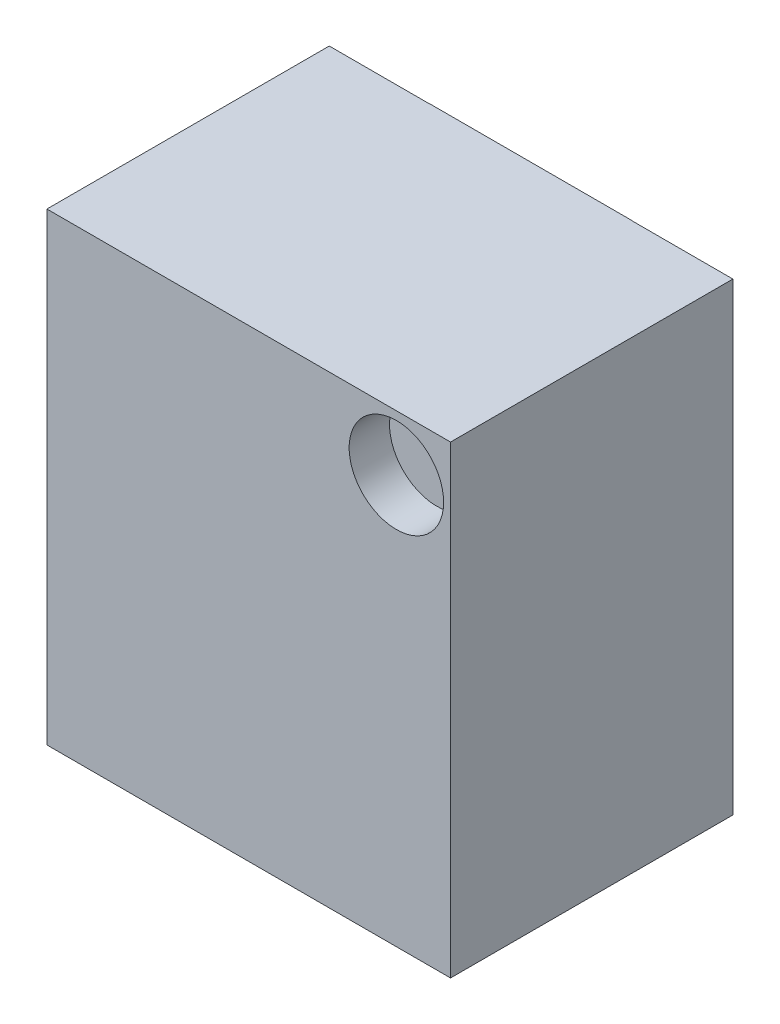
ISO-10303-21;
HEADER;
FILE_DESCRIPTION(('STEP AP214'),'2;1');
FILE_NAME('part.step','',(''),(''),'','','');
FILE_SCHEMA(('AUTOMOTIVE_DESIGN { 1 0 10303 214 1 1 1 1 }'));
ENDSEC;
DATA;
#1=APPLICATION_CONTEXT('core data for automotive mechanical design processes');
#2=APPLICATION_PROTOCOL_DEFINITION('international standard','automotive_design',2000,#1);
#3=PRODUCT_CONTEXT('',#1,'mechanical');
#4=PRODUCT('Part','Part','',(#3));
#5=PRODUCT_RELATED_PRODUCT_CATEGORY('part','',(#4));
#6=PRODUCT_DEFINITION_FORMATION('','',#4);
#7=PRODUCT_DEFINITION_CONTEXT('part definition',#1,'design');
#8=PRODUCT_DEFINITION('design','',#6,#7);
#9=PRODUCT_DEFINITION_SHAPE('','',#8);
#10=(LENGTH_UNIT() NAMED_UNIT(*) SI_UNIT(.MILLI.,.METRE.));
#11=(NAMED_UNIT(*) PLANE_ANGLE_UNIT() SI_UNIT($,.RADIAN.));
#12=(NAMED_UNIT(*) SI_UNIT($,.STERADIAN.) SOLID_ANGLE_UNIT());
#13=UNCERTAINTY_MEASURE_WITH_UNIT(LENGTH_MEASURE(1.E-05),#10,'distance_accuracy_value','');
#14=(GEOMETRIC_REPRESENTATION_CONTEXT(3) GLOBAL_UNCERTAINTY_ASSIGNED_CONTEXT((#13)) GLOBAL_UNIT_ASSIGNED_CONTEXT((#10,
#11,#12)) REPRESENTATION_CONTEXT('',''));
#15=CARTESIAN_POINT('',(0.,0.,0.));
#16=DIRECTION('',(0.,0.,1.));
#17=DIRECTION('',(1.,0.,0.));
#18=AXIS2_PLACEMENT_3D('',#15,#16,#17);
#19=CARTESIAN_POINT('',(1.,-1.15,1.4));
#20=DIRECTION('',(-1.,0.,0.));
#21=DIRECTION('',(0.,0.,1.));
#22=AXIS2_PLACEMENT_3D('',#19,#20,#21);
#23=PLANE('',#22);
#24=DIRECTION('',(0.,-1.,0.));
#25=VECTOR('',#24,1.);
#26=CARTESIAN_POINT('',(1.,-1.15,0.001));
#27=LINE('',#26,#25);
#28=CARTESIAN_POINT('',(1.,-0.65,0.001));
#29=VERTEX_POINT('',#28);
#30=CARTESIAN_POINT('',(1.,-1.15,0.001));
#31=VERTEX_POINT('',#30);
#32=EDGE_CURVE('E279',#29,#31,#27,.T.);
#33=ORIENTED_EDGE('',*,*,#32,.F.);
#34=DIRECTION('',(0.,0.,-1.));
#35=VECTOR('',#34,1.);
#36=CARTESIAN_POINT('',(1.,-0.65,0.001));
#37=LINE('',#36,#35);
#38=CARTESIAN_POINT('',(1.,-0.65,0.));
#39=VERTEX_POINT('',#38);
#40=EDGE_CURVE('E273',#29,#39,#37,.T.);
#41=ORIENTED_EDGE('',*,*,#40,.T.);
#42=DIRECTION('',(0.,1.,0.));
#43=VECTOR('',#42,1.);
#44=CARTESIAN_POINT('',(1.,-1.15,0.));
#45=LINE('',#44,#43);
#46=CARTESIAN_POINT('',(1.,0.65,0.));
#47=VERTEX_POINT('',#46);
#48=EDGE_CURVE('E201',#39,#47,#45,.T.);
#49=ORIENTED_EDGE('',*,*,#48,.T.);
#50=DIRECTION('',(0.,0.,-1.));
#51=VECTOR('',#50,1.);
#52=CARTESIAN_POINT('',(1.,0.65,0.001));
#53=LINE('',#52,#51);
#54=CARTESIAN_POINT('',(1.,0.65,0.001));
#55=VERTEX_POINT('',#54);
#56=EDGE_CURVE('E222',#55,#47,#53,.T.);
#57=ORIENTED_EDGE('',*,*,#56,.F.);
#58=DIRECTION('',(0.,-1.,0.));
#59=VECTOR('',#58,1.);
#60=CARTESIAN_POINT('',(1.,1.15,0.001));
#61=LINE('',#60,#59);
#62=CARTESIAN_POINT('',(1.,1.15,0.001));
#63=VERTEX_POINT('',#62);
#64=EDGE_CURVE('E232',#63,#55,#61,.T.);
#65=ORIENTED_EDGE('',*,*,#64,.F.);
#66=DIRECTION('',(0.,0.,-1.));
#67=VECTOR('',#66,1.);
#68=CARTESIAN_POINT('',(1.,1.15,1.4));
#69=LINE('',#68,#67);
#70=CARTESIAN_POINT('',(1.,1.15,1.4));
#71=VERTEX_POINT('',#70);
#72=EDGE_CURVE('E11',#71,#63,#69,.T.);
#73=ORIENTED_EDGE('',*,*,#72,.F.);
#74=DIRECTION('',(0.,1.,0.));
#75=VECTOR('',#74,1.);
#76=CARTESIAN_POINT('',(1.,-1.15,1.4));
#77=LINE('',#76,#75);
#78=CARTESIAN_POINT('',(1.,-1.15,1.4));
#79=VERTEX_POINT('',#78);
#80=EDGE_CURVE('E193',#79,#71,#77,.T.);
#81=ORIENTED_EDGE('',*,*,#80,.F.);
#82=DIRECTION('',(0.,0.,-1.));
#83=VECTOR('',#82,1.);
#84=CARTESIAN_POINT('',(1.,-1.15,1.4));
#85=LINE('',#84,#83);
#86=EDGE_CURVE('E183',#79,#31,#85,.T.);
#87=ORIENTED_EDGE('',*,*,#86,.T.);
#88=EDGE_LOOP('',(#33,#41,#49,#57,#65,#73,#81,#87));
#89=FACE_BOUND('',#88,.T.);
#90=ADVANCED_FACE('F39',(#89),#23,.F.);
#91=CARTESIAN_POINT('',(-1.,1.15,1.4));
#92=DIRECTION('',(0.,-1.,0.));
#93=DIRECTION('',(0.,0.,-1.));
#94=AXIS2_PLACEMENT_3D('',#91,#92,#93);
#95=PLANE('',#94);
#96=DIRECTION('',(-1.,0.,0.));
#97=VECTOR('',#96,1.);
#98=CARTESIAN_POINT('',(-1.,1.15,0.));
#99=LINE('',#98,#97);
#100=CARTESIAN_POINT('',(0.5,1.15,0.));
#101=VERTEX_POINT('',#100);
#102=CARTESIAN_POINT('',(-0.5,1.15,0.));
#103=VERTEX_POINT('',#102);
#104=EDGE_CURVE('E198',#101,#103,#99,.T.);
#105=ORIENTED_EDGE('',*,*,#104,.T.);
#106=DIRECTION('',(0.,0.,-1.));
#107=VECTOR('',#106,1.);
#108=CARTESIAN_POINT('',(-0.5,1.15,0.001));
#109=LINE('',#108,#107);
#110=CARTESIAN_POINT('',(-0.5,1.15,0.001));
#111=VERTEX_POINT('',#110);
#112=EDGE_CURVE('E54',#111,#103,#109,.T.);
#113=ORIENTED_EDGE('',*,*,#112,.F.);
#114=DIRECTION('',(1.,0.,0.));
#115=VECTOR('',#114,1.);
#116=CARTESIAN_POINT('',(-1.,1.15,0.001));
#117=LINE('',#116,#115);
#118=CARTESIAN_POINT('',(-1.,1.15,0.001));
#119=VERTEX_POINT('',#118);
#120=EDGE_CURVE('E159',#119,#111,#117,.T.);
#121=ORIENTED_EDGE('',*,*,#120,.F.);
#122=DIRECTION('',(0.,0.,-1.));
#123=VECTOR('',#122,1.);
#124=CARTESIAN_POINT('',(-1.,1.15,1.4));
#125=LINE('',#124,#123);
#126=CARTESIAN_POINT('',(-1.,1.15,1.4));
#127=VERTEX_POINT('',#126);
#128=EDGE_CURVE('E47',#127,#119,#125,.T.);
#129=ORIENTED_EDGE('',*,*,#128,.F.);
#130=DIRECTION('',(-1.,0.,0.));
#131=VECTOR('',#130,1.);
#132=CARTESIAN_POINT('',(-1.,1.15,1.4));
#133=LINE('',#132,#131);
#134=EDGE_CURVE('E209',#71,#127,#133,.T.);
#135=ORIENTED_EDGE('',*,*,#134,.F.);
#136=ORIENTED_EDGE('',*,*,#72,.T.);
#137=DIRECTION('',(1.,0.,0.));
#138=VECTOR('',#137,1.);
#139=CARTESIAN_POINT('',(1.,1.15,0.001));
#140=LINE('',#139,#138);
#141=CARTESIAN_POINT('',(0.5,1.15,0.001));
#142=VERTEX_POINT('',#141);
#143=EDGE_CURVE('E226',#142,#63,#140,.T.);
#144=ORIENTED_EDGE('',*,*,#143,.F.);
#145=DIRECTION('',(0.,0.,-1.));
#146=VECTOR('',#145,1.);
#147=CARTESIAN_POINT('',(0.5,1.15,0.001));
#148=LINE('',#147,#146);
#149=EDGE_CURVE('E218',#142,#101,#148,.T.);
#150=ORIENTED_EDGE('',*,*,#149,.T.);
#151=EDGE_LOOP('',(#105,#113,#121,#129,#135,#136,#144,#150));
#152=FACE_BOUND('',#151,.T.);
#153=ADVANCED_FACE('F170',(#152),#95,.F.);
#154=CARTESIAN_POINT('',(-1.,-1.15,1.4));
#155=DIRECTION('',(1.,0.,0.));
#156=DIRECTION('',(0.,0.,-1.));
#157=AXIS2_PLACEMENT_3D('',#154,#155,#156);
#158=PLANE('',#157);
#159=DIRECTION('',(0.,1.,0.));
#160=VECTOR('',#159,1.);
#161=CARTESIAN_POINT('',(-1.,1.15,0.001));
#162=LINE('',#161,#160);
#163=CARTESIAN_POINT('',(-1.,0.65,0.001));
#164=VERTEX_POINT('',#163);
#165=EDGE_CURVE('E155',#164,#119,#162,.T.);
#166=ORIENTED_EDGE('',*,*,#165,.F.);
#167=DIRECTION('',(0.,0.,-1.));
#168=VECTOR('',#167,1.);
#169=CARTESIAN_POINT('',(-1.,0.65,0.001));
#170=LINE('',#169,#168);
#171=CARTESIAN_POINT('',(-1.,0.65,0.));
#172=VERTEX_POINT('',#171);
#173=EDGE_CURVE('E236',#164,#172,#170,.T.);
#174=ORIENTED_EDGE('',*,*,#173,.T.);
#175=DIRECTION('',(0.,-1.,0.));
#176=VECTOR('',#175,1.);
#177=CARTESIAN_POINT('',(-1.,-1.15,0.));
#178=LINE('',#177,#176);
#179=CARTESIAN_POINT('',(-1.,-0.65,0.));
#180=VERTEX_POINT('',#179);
#181=EDGE_CURVE('E194',#172,#180,#178,.T.);
#182=ORIENTED_EDGE('',*,*,#181,.T.);
#183=DIRECTION('',(0.,0.,-1.));
#184=VECTOR('',#183,1.);
#185=CARTESIAN_POINT('',(-1.,-0.65,0.001));
#186=LINE('',#185,#184);
#187=CARTESIAN_POINT('',(-1.,-0.65,0.001));
#188=VERTEX_POINT('',#187);
#189=EDGE_CURVE('E62',#188,#180,#186,.T.);
#190=ORIENTED_EDGE('',*,*,#189,.F.);
#191=DIRECTION('',(0.,1.,0.));
#192=VECTOR('',#191,1.);
#193=CARTESIAN_POINT('',(-1.,-1.15,0.001));
#194=LINE('',#193,#192);
#195=CARTESIAN_POINT('',(-1.,-1.15,0.001));
#196=VERTEX_POINT('',#195);
#197=EDGE_CURVE('E256',#196,#188,#194,.T.);
#198=ORIENTED_EDGE('',*,*,#197,.F.);
#199=DIRECTION('',(0.,0.,-1.));
#200=VECTOR('',#199,1.);
#201=CARTESIAN_POINT('',(-1.,-1.15,1.4));
#202=LINE('',#201,#200);
#203=CARTESIAN_POINT('',(-1.,-1.15,1.4));
#204=VERTEX_POINT('',#203);
#205=EDGE_CURVE('E178',#204,#196,#202,.T.);
#206=ORIENTED_EDGE('',*,*,#205,.F.);
#207=DIRECTION('',(0.,-1.,0.));
#208=VECTOR('',#207,1.);
#209=CARTESIAN_POINT('',(-1.,-1.15,1.4));
#210=LINE('',#209,#208);
#211=EDGE_CURVE('E176',#127,#204,#210,.T.);
#212=ORIENTED_EDGE('',*,*,#211,.F.);
#213=ORIENTED_EDGE('',*,*,#128,.T.);
#214=EDGE_LOOP('',(#166,#174,#182,#190,#198,#206,#212,#213));
#215=FACE_BOUND('',#214,.T.);
#216=ADVANCED_FACE('F174',(#215),#158,.F.);
#217=CARTESIAN_POINT('',(-1.,-1.15,1.4));
#218=DIRECTION('',(0.,1.,0.));
#219=DIRECTION('',(0.,0.,1.));
#220=AXIS2_PLACEMENT_3D('',#217,#218,#219);
#221=PLANE('',#220);
#222=DIRECTION('',(1.,0.,0.));
#223=VECTOR('',#222,1.);
#224=CARTESIAN_POINT('',(-1.,-1.15,0.));
#225=LINE('',#224,#223);
#226=CARTESIAN_POINT('',(-0.5,-1.15,0.));
#227=VERTEX_POINT('',#226);
#228=CARTESIAN_POINT('',(0.5,-1.15,0.));
#229=VERTEX_POINT('',#228);
#230=EDGE_CURVE('E189',#227,#229,#225,.T.);
#231=ORIENTED_EDGE('',*,*,#230,.T.);
#232=DIRECTION('',(0.,0.,-1.));
#233=VECTOR('',#232,1.);
#234=CARTESIAN_POINT('',(0.5,-1.15,0.001));
#235=LINE('',#234,#233);
#236=CARTESIAN_POINT('',(0.5,-1.15,0.001));
#237=VERTEX_POINT('',#236);
#238=EDGE_CURVE('E268',#237,#229,#235,.T.);
#239=ORIENTED_EDGE('',*,*,#238,.F.);
#240=DIRECTION('',(-1.,0.,0.));
#241=VECTOR('',#240,1.);
#242=CARTESIAN_POINT('',(1.,-1.15,0.001));
#243=LINE('',#242,#241);
#244=EDGE_CURVE('E287',#31,#237,#243,.T.);
#245=ORIENTED_EDGE('',*,*,#244,.F.);
#246=ORIENTED_EDGE('',*,*,#86,.F.);
#247=DIRECTION('',(1.,0.,0.));
#248=VECTOR('',#247,1.);
#249=CARTESIAN_POINT('',(-1.,-1.15,1.4));
#250=LINE('',#249,#248);
#251=EDGE_CURVE('E188',#204,#79,#250,.T.);
#252=ORIENTED_EDGE('',*,*,#251,.F.);
#253=ORIENTED_EDGE('',*,*,#205,.T.);
#254=DIRECTION('',(-1.,0.,0.));
#255=VECTOR('',#254,1.);
#256=CARTESIAN_POINT('',(-1.,-1.15,0.001));
#257=LINE('',#256,#255);
#258=CARTESIAN_POINT('',(-0.5,-1.15,0.001));
#259=VERTEX_POINT('',#258);
#260=EDGE_CURVE('E248',#259,#196,#257,.T.);
#261=ORIENTED_EDGE('',*,*,#260,.F.);
#262=DIRECTION('',(0.,0.,-1.));
#263=VECTOR('',#262,1.);
#264=CARTESIAN_POINT('',(-0.5,-1.15,0.001));
#265=LINE('',#264,#263);
#266=EDGE_CURVE('E250',#259,#227,#265,.T.);
#267=ORIENTED_EDGE('',*,*,#266,.T.);
#268=EDGE_LOOP('',(#231,#239,#245,#246,#252,#253,#261,#267));
#269=FACE_BOUND('',#268,.T.);
#270=ADVANCED_FACE('F316',(#269),#221,.F.);
#271=CARTESIAN_POINT('',(0.,0.,1.4));
#272=DIRECTION('',(0.,0.,-1.));
#273=DIRECTION('',(-1.,0.,0.));
#274=AXIS2_PLACEMENT_3D('',#271,#272,#273);
#275=PLANE('',#274);
#276=CARTESIAN_POINT('',(0.731649059474648,0.874401574122885,1.4));
#277=DIRECTION('',(0.,0.,1.));
#278=DIRECTION('',(1.,0.,0.));
#279=AXIS2_PLACEMENT_3D('',#276,#277,#278);
#280=CIRCLE('',#279,0.234052446178154);
#281=CARTESIAN_POINT('',(0.965701505652802,0.874401574122885,1.4));
#282=VERTEX_POINT('',#281);
#283=EDGE_CURVE('E214',#282,#282,#280,.T.);
#284=ORIENTED_EDGE('',*,*,#283,.F.);
#285=EDGE_LOOP('',(#284));
#286=FACE_BOUND('',#285,.T.);
#287=ORIENTED_EDGE('',*,*,#80,.T.);
#288=ORIENTED_EDGE('',*,*,#134,.T.);
#289=ORIENTED_EDGE('',*,*,#211,.T.);
#290=ORIENTED_EDGE('',*,*,#251,.T.);
#291=EDGE_LOOP('',(#287,#288,#289,#290));
#292=FACE_BOUND('',#291,.T.);
#293=ADVANCED_FACE('F321',(#286,#292),#275,.F.);
#294=CARTESIAN_POINT('',(0.,0.,0.));
#295=DIRECTION('',(0.,0.,-1.));
#296=DIRECTION('',(-1.,0.,0.));
#297=AXIS2_PLACEMENT_3D('',#294,#295,#296);
#298=PLANE('',#297);
#299=DIRECTION('',(-1.,0.,0.));
#300=VECTOR('',#299,1.);
#301=CARTESIAN_POINT('',(-1.,0.65,0.));
#302=LINE('',#301,#300);
#303=CARTESIAN_POINT('',(-0.5,0.65,0.));
#304=VERTEX_POINT('',#303);
#305=EDGE_CURVE('E165',#304,#172,#302,.T.);
#306=ORIENTED_EDGE('',*,*,#305,.F.);
#307=DIRECTION('',(0.,-1.,0.));
#308=VECTOR('',#307,1.);
#309=CARTESIAN_POINT('',(-0.5,1.15,0.));
#310=LINE('',#309,#308);
#311=EDGE_CURVE('E276',#103,#304,#310,.T.);
#312=ORIENTED_EDGE('',*,*,#311,.F.);
#313=ORIENTED_EDGE('',*,*,#104,.F.);
#314=DIRECTION('',(0.,1.,0.));
#315=VECTOR('',#314,1.);
#316=CARTESIAN_POINT('',(0.5,1.15,0.));
#317=LINE('',#316,#315);
#318=CARTESIAN_POINT('',(0.5,0.65,0.));
#319=VERTEX_POINT('',#318);
#320=EDGE_CURVE('E230',#319,#101,#317,.T.);
#321=ORIENTED_EDGE('',*,*,#320,.F.);
#322=DIRECTION('',(-1.,0.,0.));
#323=VECTOR('',#322,1.);
#324=CARTESIAN_POINT('',(1.,0.65,0.));
#325=LINE('',#324,#323);
#326=EDGE_CURVE('E233',#47,#319,#325,.T.);
#327=ORIENTED_EDGE('',*,*,#326,.F.);
#328=ORIENTED_EDGE('',*,*,#48,.F.);
#329=DIRECTION('',(1.,0.,0.));
#330=VECTOR('',#329,1.);
#331=CARTESIAN_POINT('',(1.,-0.65,0.));
#332=LINE('',#331,#330);
#333=CARTESIAN_POINT('',(0.5,-0.65,0.));
#334=VERTEX_POINT('',#333);
#335=EDGE_CURVE('E277',#334,#39,#332,.T.);
#336=ORIENTED_EDGE('',*,*,#335,.F.);
#337=DIRECTION('',(0.,1.,0.));
#338=VECTOR('',#337,1.);
#339=CARTESIAN_POINT('',(0.5,-1.15,0.));
#340=LINE('',#339,#338);
#341=EDGE_CURVE('E253',#229,#334,#340,.T.);
#342=ORIENTED_EDGE('',*,*,#341,.F.);
#343=ORIENTED_EDGE('',*,*,#230,.F.);
#344=DIRECTION('',(0.,-1.,0.));
#345=VECTOR('',#344,1.);
#346=CARTESIAN_POINT('',(-0.5,-1.15,0.));
#347=LINE('',#346,#345);
#348=CARTESIAN_POINT('',(-0.5,-0.65,0.));
#349=VERTEX_POINT('',#348);
#350=EDGE_CURVE('E254',#349,#227,#347,.T.);
#351=ORIENTED_EDGE('',*,*,#350,.F.);
#352=DIRECTION('',(1.,0.,0.));
#353=VECTOR('',#352,1.);
#354=CARTESIAN_POINT('',(-1.,-0.65,0.));
#355=LINE('',#354,#353);
#356=EDGE_CURVE('E257',#180,#349,#355,.T.);
#357=ORIENTED_EDGE('',*,*,#356,.F.);
#358=ORIENTED_EDGE('',*,*,#181,.F.);
#359=EDGE_LOOP('',(#306,#312,#313,#321,#327,#328,#336,#342,#343,#351,#357,#358));
#360=FACE_BOUND('',#359,.T.);
#361=ADVANCED_FACE('F303',(#360),#298,.T.);
#362=CARTESIAN_POINT('',(0.731649059474648,0.874401574122885,1.2));
#363=DIRECTION('',(0.,0.,1.));
#364=DIRECTION('',(1.,0.,0.));
#365=AXIS2_PLACEMENT_3D('',#362,#363,#364);
#366=CYLINDRICAL_SURFACE('',#365,0.234052446178154);
#367=CARTESIAN_POINT('',(0.731649059474648,0.874401574122885,1.2));
#368=DIRECTION('',(0.,0.,1.));
#369=DIRECTION('',(1.,0.,0.));
#370=AXIS2_PLACEMENT_3D('',#367,#368,#369);
#371=CIRCLE('',#370,0.234052446178154);
#372=CARTESIAN_POINT('',(0.965701505652802,0.874401574122885,1.2));
#373=VERTEX_POINT('',#372);
#374=EDGE_CURVE('E204',#373,#373,#371,.T.);
#375=ORIENTED_EDGE('',*,*,#374,.F.);
#376=EDGE_LOOP('',(#375));
#377=FACE_BOUND('',#376,.T.);
#378=ORIENTED_EDGE('',*,*,#283,.T.);
#379=EDGE_LOOP('',(#378));
#380=FACE_BOUND('',#379,.T.);
#381=ADVANCED_FACE('F361',(#377,#380),#366,.F.);
#382=CARTESIAN_POINT('',(0.731649059474648,0.874401574122885,1.2));
#383=DIRECTION('',(0.,0.,1.));
#384=DIRECTION('',(1.,0.,0.));
#385=AXIS2_PLACEMENT_3D('',#382,#383,#384);
#386=PLANE('',#385);
#387=ORIENTED_EDGE('',*,*,#374,.T.);
#388=EDGE_LOOP('',(#387));
#389=FACE_BOUND('',#388,.T.);
#390=ADVANCED_FACE('F367',(#389),#386,.T.);
#391=CARTESIAN_POINT('',(0.5,1.15,0.001));
#392=DIRECTION('',(-1.,0.,0.));
#393=DIRECTION('',(0.,0.,1.));
#394=AXIS2_PLACEMENT_3D('',#391,#392,#393);
#395=PLANE('',#394);
#396=ORIENTED_EDGE('',*,*,#320,.T.);
#397=ORIENTED_EDGE('',*,*,#149,.F.);
#398=DIRECTION('',(0.,1.,0.));
#399=VECTOR('',#398,1.);
#400=CARTESIAN_POINT('',(0.5,1.15,0.001));
#401=LINE('',#400,#399);
#402=CARTESIAN_POINT('',(0.5,0.65,0.001));
#403=VERTEX_POINT('',#402);
#404=EDGE_CURVE('E238',#403,#142,#401,.T.);
#405=ORIENTED_EDGE('',*,*,#404,.F.);
#406=DIRECTION('',(0.,0.,-1.));
#407=VECTOR('',#406,1.);
#408=CARTESIAN_POINT('',(0.5,0.65,0.001));
#409=LINE('',#408,#407);
#410=EDGE_CURVE('E225',#403,#319,#409,.T.);
#411=ORIENTED_EDGE('',*,*,#410,.T.);
#412=EDGE_LOOP('',(#396,#397,#405,#411));
#413=FACE_BOUND('',#412,.T.);
#414=ADVANCED_FACE('F332',(#413),#395,.F.);
#415=CARTESIAN_POINT('',(1.,0.65,0.001));
#416=DIRECTION('',(0.,-1.,0.));
#417=DIRECTION('',(0.,0.,-1.));
#418=AXIS2_PLACEMENT_3D('',#415,#416,#417);
#419=PLANE('',#418);
#420=ORIENTED_EDGE('',*,*,#326,.T.);
#421=ORIENTED_EDGE('',*,*,#410,.F.);
#422=DIRECTION('',(-1.,0.,0.));
#423=VECTOR('',#422,1.);
#424=CARTESIAN_POINT('',(1.,0.65,0.001));
#425=LINE('',#424,#423);
#426=EDGE_CURVE('E241',#55,#403,#425,.T.);
#427=ORIENTED_EDGE('',*,*,#426,.F.);
#428=ORIENTED_EDGE('',*,*,#56,.T.);
#429=EDGE_LOOP('',(#420,#421,#427,#428));
#430=FACE_BOUND('',#429,.T.);
#431=ADVANCED_FACE('F372',(#430),#419,.F.);
#432=CARTESIAN_POINT('',(0.,0.,0.001));
#433=DIRECTION('',(0.,0.,-1.));
#434=DIRECTION('',(-1.,0.,0.));
#435=AXIS2_PLACEMENT_3D('',#432,#433,#434);
#436=PLANE('',#435);
#437=ORIENTED_EDGE('',*,*,#64,.T.);
#438=ORIENTED_EDGE('',*,*,#426,.T.);
#439=ORIENTED_EDGE('',*,*,#404,.T.);
#440=ORIENTED_EDGE('',*,*,#143,.T.);
#441=EDGE_LOOP('',(#437,#438,#439,#440));
#442=FACE_BOUND('',#441,.T.);
#443=ADVANCED_FACE('F329',(#442),#436,.T.);
#444=CARTESIAN_POINT('',(-0.5,-1.15,0.001));
#445=DIRECTION('',(1.,0.,0.));
#446=DIRECTION('',(0.,0.,-1.));
#447=AXIS2_PLACEMENT_3D('',#444,#445,#446);
#448=PLANE('',#447);
#449=ORIENTED_EDGE('',*,*,#350,.T.);
#450=ORIENTED_EDGE('',*,*,#266,.F.);
#451=DIRECTION('',(0.,-1.,0.));
#452=VECTOR('',#451,1.);
#453=CARTESIAN_POINT('',(-0.5,-1.15,0.001));
#454=LINE('',#453,#452);
#455=CARTESIAN_POINT('',(-0.5,-0.65,0.001));
#456=VERTEX_POINT('',#455);
#457=EDGE_CURVE('E260',#456,#259,#454,.T.);
#458=ORIENTED_EDGE('',*,*,#457,.F.);
#459=DIRECTION('',(0.,0.,-1.));
#460=VECTOR('',#459,1.);
#461=CARTESIAN_POINT('',(-0.5,-0.65,0.001));
#462=LINE('',#461,#460);
#463=EDGE_CURVE('E247',#456,#349,#462,.T.);
#464=ORIENTED_EDGE('',*,*,#463,.T.);
#465=EDGE_LOOP('',(#449,#450,#458,#464));
#466=FACE_BOUND('',#465,.T.);
#467=ADVANCED_FACE('F309',(#466),#448,.F.);
#468=CARTESIAN_POINT('',(-1.,-0.65,0.001));
#469=DIRECTION('',(0.,1.,0.));
#470=DIRECTION('',(0.,0.,1.));
#471=AXIS2_PLACEMENT_3D('',#468,#469,#470);
#472=PLANE('',#471);
#473=ORIENTED_EDGE('',*,*,#356,.T.);
#474=ORIENTED_EDGE('',*,*,#463,.F.);
#475=DIRECTION('',(1.,0.,0.));
#476=VECTOR('',#475,1.);
#477=CARTESIAN_POINT('',(-1.,-0.65,0.001));
#478=LINE('',#477,#476);
#479=EDGE_CURVE('E263',#188,#456,#478,.T.);
#480=ORIENTED_EDGE('',*,*,#479,.F.);
#481=ORIENTED_EDGE('',*,*,#189,.T.);
#482=EDGE_LOOP('',(#473,#474,#480,#481));
#483=FACE_BOUND('',#482,.T.);
#484=ADVANCED_FACE('F306',(#483),#472,.F.);
#485=CARTESIAN_POINT('',(0.,0.,0.001));
#486=DIRECTION('',(0.,0.,-1.));
#487=DIRECTION('',(-1.,0.,0.));
#488=AXIS2_PLACEMENT_3D('',#485,#486,#487);
#489=PLANE('',#488);
#490=ORIENTED_EDGE('',*,*,#197,.T.);
#491=ORIENTED_EDGE('',*,*,#479,.T.);
#492=ORIENTED_EDGE('',*,*,#457,.T.);
#493=ORIENTED_EDGE('',*,*,#260,.T.);
#494=EDGE_LOOP('',(#490,#491,#492,#493));
#495=FACE_BOUND('',#494,.T.);
#496=ADVANCED_FACE('F312',(#495),#489,.T.);
#497=CARTESIAN_POINT('',(1.,-0.65,0.001));
#498=DIRECTION('',(0.,1.,0.));
#499=DIRECTION('',(0.,0.,1.));
#500=AXIS2_PLACEMENT_3D('',#497,#498,#499);
#501=PLANE('',#500);
#502=ORIENTED_EDGE('',*,*,#335,.T.);
#503=ORIENTED_EDGE('',*,*,#40,.F.);
#504=DIRECTION('',(1.,0.,0.));
#505=VECTOR('',#504,1.);
#506=CARTESIAN_POINT('',(1.,-0.65,0.001));
#507=LINE('',#506,#505);
#508=CARTESIAN_POINT('',(0.5,-0.65,0.001));
#509=VERTEX_POINT('',#508);
#510=EDGE_CURVE('E271',#509,#29,#507,.T.);
#511=ORIENTED_EDGE('',*,*,#510,.F.);
#512=DIRECTION('',(0.,0.,-1.));
#513=VECTOR('',#512,1.);
#514=CARTESIAN_POINT('',(0.5,-0.65,0.001));
#515=LINE('',#514,#513);
#516=EDGE_CURVE('E270',#509,#334,#515,.T.);
#517=ORIENTED_EDGE('',*,*,#516,.T.);
#518=EDGE_LOOP('',(#502,#503,#511,#517));
#519=FACE_BOUND('',#518,.T.);
#520=ADVANCED_FACE('F386',(#519),#501,.F.);
#521=CARTESIAN_POINT('',(0.5,-1.15,0.001));
#522=DIRECTION('',(-1.,0.,0.));
#523=DIRECTION('',(0.,0.,1.));
#524=AXIS2_PLACEMENT_3D('',#521,#522,#523);
#525=PLANE('',#524);
#526=ORIENTED_EDGE('',*,*,#341,.T.);
#527=ORIENTED_EDGE('',*,*,#516,.F.);
#528=DIRECTION('',(0.,1.,0.));
#529=VECTOR('',#528,1.);
#530=CARTESIAN_POINT('',(0.5,-1.15,0.001));
#531=LINE('',#530,#529);
#532=EDGE_CURVE('E284',#237,#509,#531,.T.);
#533=ORIENTED_EDGE('',*,*,#532,.F.);
#534=ORIENTED_EDGE('',*,*,#238,.T.);
#535=EDGE_LOOP('',(#526,#527,#533,#534));
#536=FACE_BOUND('',#535,.T.);
#537=ADVANCED_FACE('F387',(#536),#525,.F.);
#538=CARTESIAN_POINT('',(0.,0.,0.001));
#539=DIRECTION('',(0.,0.,1.));
#540=DIRECTION('',(1.,0.,0.));
#541=AXIS2_PLACEMENT_3D('',#538,#539,#540);
#542=PLANE('',#541);
#543=ORIENTED_EDGE('',*,*,#32,.T.);
#544=ORIENTED_EDGE('',*,*,#244,.T.);
#545=ORIENTED_EDGE('',*,*,#532,.T.);
#546=ORIENTED_EDGE('',*,*,#510,.T.);
#547=EDGE_LOOP('',(#543,#544,#545,#546));
#548=FACE_BOUND('',#547,.T.);
#549=ADVANCED_FACE('F344',(#548),#542,.F.);
#550=CARTESIAN_POINT('',(-1.,0.65,0.001));
#551=DIRECTION('',(0.,-1.,0.));
#552=DIRECTION('',(0.,0.,-1.));
#553=AXIS2_PLACEMENT_3D('',#550,#551,#552);
#554=PLANE('',#553);
#555=ORIENTED_EDGE('',*,*,#305,.T.);
#556=ORIENTED_EDGE('',*,*,#173,.F.);
#557=DIRECTION('',(-1.,0.,0.));
#558=VECTOR('',#557,1.);
#559=CARTESIAN_POINT('',(-1.,0.65,0.001));
#560=LINE('',#559,#558);
#561=CARTESIAN_POINT('',(-0.5,0.65,0.001));
#562=VERTEX_POINT('',#561);
#563=EDGE_CURVE('E161',#562,#164,#560,.T.);
#564=ORIENTED_EDGE('',*,*,#563,.F.);
#565=DIRECTION('',(0.,0.,-1.));
#566=VECTOR('',#565,1.);
#567=CARTESIAN_POINT('',(-0.5,0.65,0.001));
#568=LINE('',#567,#566);
#569=EDGE_CURVE('E292',#562,#304,#568,.T.);
#570=ORIENTED_EDGE('',*,*,#569,.T.);
#571=EDGE_LOOP('',(#555,#556,#564,#570));
#572=FACE_BOUND('',#571,.T.);
#573=ADVANCED_FACE('F299',(#572),#554,.F.);
#574=CARTESIAN_POINT('',(-0.5,1.15,0.001));
#575=DIRECTION('',(1.,0.,0.));
#576=DIRECTION('',(0.,0.,-1.));
#577=AXIS2_PLACEMENT_3D('',#574,#575,#576);
#578=PLANE('',#577);
#579=ORIENTED_EDGE('',*,*,#311,.T.);
#580=ORIENTED_EDGE('',*,*,#569,.F.);
#581=DIRECTION('',(0.,-1.,0.));
#582=VECTOR('',#581,1.);
#583=CARTESIAN_POINT('',(-0.5,1.15,0.001));
#584=LINE('',#583,#582);
#585=EDGE_CURVE('E172',#111,#562,#584,.T.);
#586=ORIENTED_EDGE('',*,*,#585,.F.);
#587=ORIENTED_EDGE('',*,*,#112,.T.);
#588=EDGE_LOOP('',(#579,#580,#586,#587));
#589=FACE_BOUND('',#588,.T.);
#590=ADVANCED_FACE('F336',(#589),#578,.F.);
#591=CARTESIAN_POINT('',(0.,0.,0.001));
#592=DIRECTION('',(0.,0.,1.));
#593=DIRECTION('',(1.,0.,0.));
#594=AXIS2_PLACEMENT_3D('',#591,#592,#593);
#595=PLANE('',#594);
#596=ORIENTED_EDGE('',*,*,#165,.T.);
#597=ORIENTED_EDGE('',*,*,#120,.T.);
#598=ORIENTED_EDGE('',*,*,#585,.T.);
#599=ORIENTED_EDGE('',*,*,#563,.T.);
#600=EDGE_LOOP('',(#596,#597,#598,#599));
#601=FACE_BOUND('',#600,.T.);
#602=ADVANCED_FACE('F157',(#601),#595,.F.);
#603=CLOSED_SHELL('',(#90,#153,#216,#270,#293,#361,#381,#390,#414,#431,#443,#467,#484,#496,#520,
#537,#549,#573,#590,#602));
#604=MANIFOLD_SOLID_BREP('B2',#603);
#605=ADVANCED_BREP_SHAPE_REPRESENTATION('',(#18,#604),#14);
#606=SHAPE_DEFINITION_REPRESENTATION(#9,#605);
ENDSEC;
END-ISO-10303-21;
